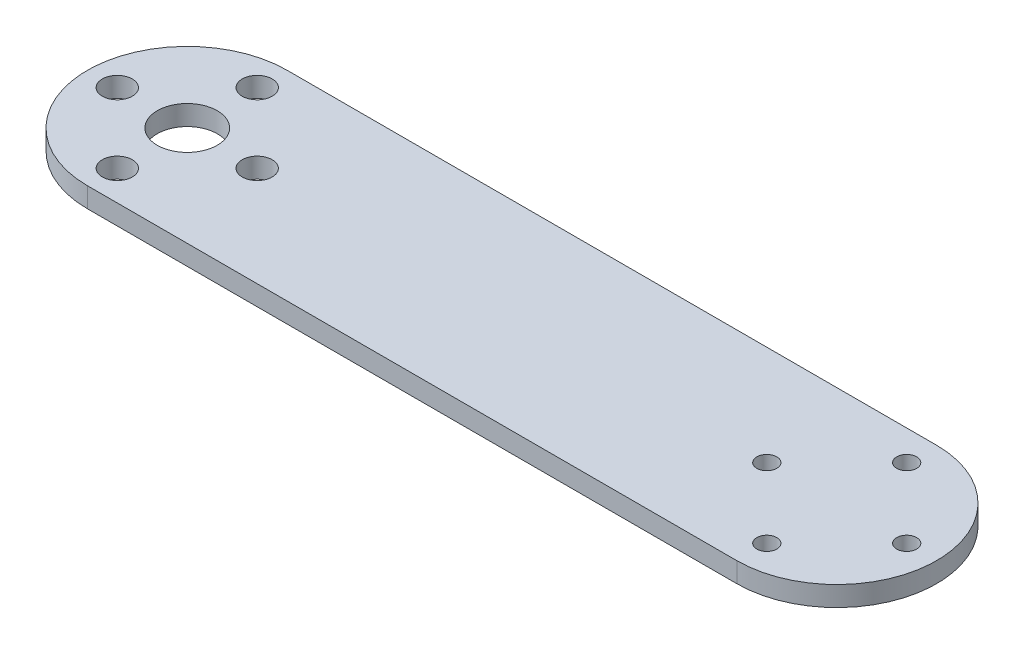
ISO-10303-21;
HEADER;
FILE_DESCRIPTION(('STEP AP214'),'2;1');
FILE_NAME('part.step','',(''),(''),'','','');
FILE_SCHEMA(('AUTOMOTIVE_DESIGN { 1 0 10303 214 1 1 1 1 }'));
ENDSEC;
DATA;
#1=APPLICATION_CONTEXT('core data for automotive mechanical design processes');
#2=APPLICATION_PROTOCOL_DEFINITION('international standard','automotive_design',2000,#1);
#3=PRODUCT_CONTEXT('',#1,'mechanical');
#4=PRODUCT('Part','Part','',(#3));
#5=PRODUCT_RELATED_PRODUCT_CATEGORY('part','',(#4));
#6=PRODUCT_DEFINITION_FORMATION('','',#4);
#7=PRODUCT_DEFINITION_CONTEXT('part definition',#1,'design');
#8=PRODUCT_DEFINITION('design','',#6,#7);
#9=PRODUCT_DEFINITION_SHAPE('','',#8);
#10=(LENGTH_UNIT() NAMED_UNIT(*) SI_UNIT(.MILLI.,.METRE.));
#11=(NAMED_UNIT(*) PLANE_ANGLE_UNIT() SI_UNIT($,.RADIAN.));
#12=(NAMED_UNIT(*) SI_UNIT($,.STERADIAN.) SOLID_ANGLE_UNIT());
#13=UNCERTAINTY_MEASURE_WITH_UNIT(LENGTH_MEASURE(1.E-05),#10,'distance_accuracy_value','');
#14=(GEOMETRIC_REPRESENTATION_CONTEXT(3) GLOBAL_UNCERTAINTY_ASSIGNED_CONTEXT((#13)) GLOBAL_UNIT_ASSIGNED_CONTEXT((#10,
#11,#12)) REPRESENTATION_CONTEXT('',''));
#15=CARTESIAN_POINT('',(0.,0.,0.));
#16=DIRECTION('',(0.,0.,1.));
#17=DIRECTION('',(1.,0.,0.));
#18=AXIS2_PLACEMENT_3D('',#15,#16,#17);
#19=CARTESIAN_POINT('',(0.,2.,0.));
#20=DIRECTION('',(0.,1.,0.));
#21=DIRECTION('',(0.,0.,1.));
#22=AXIS2_PLACEMENT_3D('',#19,#20,#21);
#23=PLANE('',#22);
#24=CARTESIAN_POINT('',(65.,2.,7.00000000000001));
#25=DIRECTION('',(0.,1.,0.));
#26=DIRECTION('',(0.,0.,1.));
#27=AXIS2_PLACEMENT_3D('',#24,#25,#26);
#28=CIRCLE('',#27,0.999999999999969);
#29=CARTESIAN_POINT('',(65.,2.,7.99999999999998));
#30=VERTEX_POINT('',#29);
#31=EDGE_CURVE('E153',#30,#30,#28,.T.);
#32=ORIENTED_EDGE('',*,*,#31,.F.);
#33=EDGE_LOOP('',(#32));
#34=FACE_BOUND('',#33,.T.);
#35=CARTESIAN_POINT('',(65.,2.,-7.00000000000001));
#36=DIRECTION('',(0.,1.,0.));
#37=DIRECTION('',(0.,0.,1.));
#38=AXIS2_PLACEMENT_3D('',#35,#36,#37);
#39=CIRCLE('',#38,0.999999999999969);
#40=CARTESIAN_POINT('',(65.,2.,-6.00000000000005));
#41=VERTEX_POINT('',#40);
#42=EDGE_CURVE('E141',#41,#41,#39,.T.);
#43=ORIENTED_EDGE('',*,*,#42,.F.);
#44=EDGE_LOOP('',(#43));
#45=FACE_BOUND('',#44,.T.);
#46=CARTESIAN_POINT('',(0.,2.,7.));
#47=DIRECTION('',(0.,1.,0.));
#48=DIRECTION('',(0.,0.,1.));
#49=AXIS2_PLACEMENT_3D('',#46,#47,#48);
#50=CIRCLE('',#49,1.5);
#51=CARTESIAN_POINT('',(0.,2.,8.5));
#52=VERTEX_POINT('',#51);
#53=EDGE_CURVE('E129',#52,#52,#50,.T.);
#54=ORIENTED_EDGE('',*,*,#53,.F.);
#55=EDGE_LOOP('',(#54));
#56=FACE_BOUND('',#55,.T.);
#57=CARTESIAN_POINT('',(0.,2.,-7.));
#58=DIRECTION('',(0.,1.,0.));
#59=DIRECTION('',(0.,0.,1.));
#60=AXIS2_PLACEMENT_3D('',#57,#58,#59);
#61=CIRCLE('',#60,1.5);
#62=CARTESIAN_POINT('',(0.,2.,-5.5));
#63=VERTEX_POINT('',#62);
#64=EDGE_CURVE('E117',#63,#63,#61,.T.);
#65=ORIENTED_EDGE('',*,*,#64,.F.);
#66=EDGE_LOOP('',(#65));
#67=FACE_BOUND('',#66,.T.);
#68=CARTESIAN_POINT('',(0.,2.,0.));
#69=DIRECTION('',(0.,1.,0.));
#70=DIRECTION('',(0.,0.,1.));
#71=AXIS2_PLACEMENT_3D('',#68,#69,#70);
#72=CIRCLE('',#71,10.);
#73=CARTESIAN_POINT('',(0.,2.,-10.));
#74=VERTEX_POINT('',#73);
#75=CARTESIAN_POINT('',(0.,2.,10.));
#76=VERTEX_POINT('',#75);
#77=EDGE_CURVE('E87',#74,#76,#72,.T.);
#78=ORIENTED_EDGE('',*,*,#77,.T.);
#79=DIRECTION('',(1.,0.,0.));
#80=VECTOR('',#79,1.);
#81=CARTESIAN_POINT('',(0.,2.,10.));
#82=LINE('',#81,#80);
#83=CARTESIAN_POINT('',(65.,2.,10.));
#84=VERTEX_POINT('',#83);
#85=EDGE_CURVE('E82',#76,#84,#82,.T.);
#86=ORIENTED_EDGE('',*,*,#85,.T.);
#87=CARTESIAN_POINT('',(65.,2.,0.));
#88=DIRECTION('',(0.,1.,0.));
#89=DIRECTION('',(0.,0.,1.));
#90=AXIS2_PLACEMENT_3D('',#87,#88,#89);
#91=CIRCLE('',#90,10.);
#92=CARTESIAN_POINT('',(65.,2.,-10.));
#93=VERTEX_POINT('',#92);
#94=EDGE_CURVE('E85',#84,#93,#91,.T.);
#95=ORIENTED_EDGE('',*,*,#94,.T.);
#96=DIRECTION('',(-1.,0.,0.));
#97=VECTOR('',#96,1.);
#98=CARTESIAN_POINT('',(0.,2.,-10.));
#99=LINE('',#98,#97);
#100=EDGE_CURVE('E52',#93,#74,#99,.T.);
#101=ORIENTED_EDGE('',*,*,#100,.T.);
#102=EDGE_LOOP('',(#78,#86,#95,#101));
#103=FACE_BOUND('',#102,.T.);
#104=CARTESIAN_POINT('',(0.,2.,0.));
#105=DIRECTION('',(0.,1.,0.));
#106=DIRECTION('',(0.,0.,1.));
#107=AXIS2_PLACEMENT_3D('',#104,#105,#106);
#108=CIRCLE('',#107,3.);
#109=CARTESIAN_POINT('',(0.,2.,3.));
#110=VERTEX_POINT('',#109);
#111=EDGE_CURVE('E102',#110,#110,#108,.T.);
#112=ORIENTED_EDGE('',*,*,#111,.F.);
#113=EDGE_LOOP('',(#112));
#114=FACE_BOUND('',#113,.T.);
#115=CARTESIAN_POINT('',(7.,2.,0.));
#116=DIRECTION('',(0.,1.,0.));
#117=DIRECTION('',(0.,0.,1.));
#118=AXIS2_PLACEMENT_3D('',#115,#116,#117);
#119=CIRCLE('',#118,1.5);
#120=CARTESIAN_POINT('',(7.,2.,1.5));
#121=VERTEX_POINT('',#120);
#122=EDGE_CURVE('E123',#121,#121,#119,.T.);
#123=ORIENTED_EDGE('',*,*,#122,.F.);
#124=EDGE_LOOP('',(#123));
#125=FACE_BOUND('',#124,.T.);
#126=CARTESIAN_POINT('',(-7.,2.,0.));
#127=DIRECTION('',(0.,1.,0.));
#128=DIRECTION('',(0.,0.,1.));
#129=AXIS2_PLACEMENT_3D('',#126,#127,#128);
#130=CIRCLE('',#129,1.5);
#131=CARTESIAN_POINT('',(-7.,2.,1.5));
#132=VERTEX_POINT('',#131);
#133=EDGE_CURVE('E135',#132,#132,#130,.T.);
#134=ORIENTED_EDGE('',*,*,#133,.F.);
#135=EDGE_LOOP('',(#134));
#136=FACE_BOUND('',#135,.T.);
#137=CARTESIAN_POINT('',(72.,2.,0.));
#138=DIRECTION('',(0.,1.,0.));
#139=DIRECTION('',(0.,0.,1.));
#140=AXIS2_PLACEMENT_3D('',#137,#138,#139);
#141=CIRCLE('',#140,0.999999999999998);
#142=CARTESIAN_POINT('',(72.,2.,0.999999999999998));
#143=VERTEX_POINT('',#142);
#144=EDGE_CURVE('E147',#143,#143,#141,.T.);
#145=ORIENTED_EDGE('',*,*,#144,.F.);
#146=EDGE_LOOP('',(#145));
#147=FACE_BOUND('',#146,.T.);
#148=CARTESIAN_POINT('',(58.,2.,0.));
#149=DIRECTION('',(0.,1.,0.));
#150=DIRECTION('',(0.,0.,1.));
#151=AXIS2_PLACEMENT_3D('',#148,#149,#150);
#152=CIRCLE('',#151,0.999999999999984);
#153=CARTESIAN_POINT('',(58.,2.,0.999999999999984));
#154=VERTEX_POINT('',#153);
#155=EDGE_CURVE('E159',#154,#154,#152,.T.);
#156=ORIENTED_EDGE('',*,*,#155,.F.);
#157=EDGE_LOOP('',(#156));
#158=FACE_BOUND('',#157,.T.);
#159=ADVANCED_FACE('F35',(#34,#45,#56,#67,#103,#114,#125,#136,#147,#158),#23,.T.);
#160=CARTESIAN_POINT('',(0.,0.,0.));
#161=DIRECTION('',(0.,1.,0.));
#162=DIRECTION('',(0.,0.,1.));
#163=AXIS2_PLACEMENT_3D('',#160,#161,#162);
#164=PLANE('',#163);
#165=CARTESIAN_POINT('',(0.,0.,0.));
#166=DIRECTION('',(0.,1.,0.));
#167=DIRECTION('',(0.,0.,1.));
#168=AXIS2_PLACEMENT_3D('',#165,#166,#167);
#169=CIRCLE('',#168,10.);
#170=CARTESIAN_POINT('',(0.,0.,-10.));
#171=VERTEX_POINT('',#170);
#172=CARTESIAN_POINT('',(0.,0.,10.));
#173=VERTEX_POINT('',#172);
#174=EDGE_CURVE('E99',#171,#173,#169,.T.);
#175=ORIENTED_EDGE('',*,*,#174,.F.);
#176=DIRECTION('',(-1.,0.,0.));
#177=VECTOR('',#176,1.);
#178=CARTESIAN_POINT('',(0.,0.,-10.));
#179=LINE('',#178,#177);
#180=CARTESIAN_POINT('',(65.,0.,-10.));
#181=VERTEX_POINT('',#180);
#182=EDGE_CURVE('E75',#181,#171,#179,.T.);
#183=ORIENTED_EDGE('',*,*,#182,.F.);
#184=CARTESIAN_POINT('',(65.,0.,0.));
#185=DIRECTION('',(0.,1.,0.));
#186=DIRECTION('',(0.,0.,1.));
#187=AXIS2_PLACEMENT_3D('',#184,#185,#186);
#188=CIRCLE('',#187,10.);
#189=CARTESIAN_POINT('',(65.,0.,10.));
#190=VERTEX_POINT('',#189);
#191=EDGE_CURVE('E69',#190,#181,#188,.T.);
#192=ORIENTED_EDGE('',*,*,#191,.F.);
#193=DIRECTION('',(1.,0.,0.));
#194=VECTOR('',#193,1.);
#195=CARTESIAN_POINT('',(0.,0.,10.));
#196=LINE('',#195,#194);
#197=EDGE_CURVE('E91',#173,#190,#196,.T.);
#198=ORIENTED_EDGE('',*,*,#197,.F.);
#199=EDGE_LOOP('',(#175,#183,#192,#198));
#200=FACE_BOUND('',#199,.T.);
#201=CARTESIAN_POINT('',(0.,0.,0.));
#202=DIRECTION('',(0.,1.,0.));
#203=DIRECTION('',(0.,0.,1.));
#204=AXIS2_PLACEMENT_3D('',#201,#202,#203);
#205=CIRCLE('',#204,3.);
#206=CARTESIAN_POINT('',(0.,0.,3.));
#207=VERTEX_POINT('',#206);
#208=EDGE_CURVE('E114',#207,#207,#205,.T.);
#209=ORIENTED_EDGE('',*,*,#208,.T.);
#210=EDGE_LOOP('',(#209));
#211=FACE_BOUND('',#210,.T.);
#212=CARTESIAN_POINT('',(0.,0.,-7.));
#213=DIRECTION('',(0.,1.,0.));
#214=DIRECTION('',(0.,0.,1.));
#215=AXIS2_PLACEMENT_3D('',#212,#213,#214);
#216=CIRCLE('',#215,1.5);
#217=CARTESIAN_POINT('',(0.,0.,-5.5));
#218=VERTEX_POINT('',#217);
#219=EDGE_CURVE('E120',#218,#218,#216,.T.);
#220=ORIENTED_EDGE('',*,*,#219,.T.);
#221=EDGE_LOOP('',(#220));
#222=FACE_BOUND('',#221,.T.);
#223=CARTESIAN_POINT('',(7.,0.,0.));
#224=DIRECTION('',(0.,1.,0.));
#225=DIRECTION('',(0.,0.,1.));
#226=AXIS2_PLACEMENT_3D('',#223,#224,#225);
#227=CIRCLE('',#226,1.5);
#228=CARTESIAN_POINT('',(7.,0.,1.5));
#229=VERTEX_POINT('',#228);
#230=EDGE_CURVE('E126',#229,#229,#227,.T.);
#231=ORIENTED_EDGE('',*,*,#230,.T.);
#232=EDGE_LOOP('',(#231));
#233=FACE_BOUND('',#232,.T.);
#234=CARTESIAN_POINT('',(0.,0.,7.));
#235=DIRECTION('',(0.,1.,0.));
#236=DIRECTION('',(0.,0.,1.));
#237=AXIS2_PLACEMENT_3D('',#234,#235,#236);
#238=CIRCLE('',#237,1.5);
#239=CARTESIAN_POINT('',(0.,0.,8.5));
#240=VERTEX_POINT('',#239);
#241=EDGE_CURVE('E132',#240,#240,#238,.T.);
#242=ORIENTED_EDGE('',*,*,#241,.T.);
#243=EDGE_LOOP('',(#242));
#244=FACE_BOUND('',#243,.T.);
#245=CARTESIAN_POINT('',(-7.,0.,0.));
#246=DIRECTION('',(0.,1.,0.));
#247=DIRECTION('',(0.,0.,1.));
#248=AXIS2_PLACEMENT_3D('',#245,#246,#247);
#249=CIRCLE('',#248,1.5);
#250=CARTESIAN_POINT('',(-7.,0.,1.5));
#251=VERTEX_POINT('',#250);
#252=EDGE_CURVE('E138',#251,#251,#249,.T.);
#253=ORIENTED_EDGE('',*,*,#252,.T.);
#254=EDGE_LOOP('',(#253));
#255=FACE_BOUND('',#254,.T.);
#256=CARTESIAN_POINT('',(65.,0.,-7.00000000000001));
#257=DIRECTION('',(0.,1.,0.));
#258=DIRECTION('',(0.,0.,1.));
#259=AXIS2_PLACEMENT_3D('',#256,#257,#258);
#260=CIRCLE('',#259,0.999999999999969);
#261=CARTESIAN_POINT('',(65.,0.,-6.00000000000005));
#262=VERTEX_POINT('',#261);
#263=EDGE_CURVE('E144',#262,#262,#260,.T.);
#264=ORIENTED_EDGE('',*,*,#263,.T.);
#265=EDGE_LOOP('',(#264));
#266=FACE_BOUND('',#265,.T.);
#267=CARTESIAN_POINT('',(72.,0.,0.));
#268=DIRECTION('',(0.,1.,0.));
#269=DIRECTION('',(0.,0.,1.));
#270=AXIS2_PLACEMENT_3D('',#267,#268,#269);
#271=CIRCLE('',#270,0.999999999999998);
#272=CARTESIAN_POINT('',(72.,0.,0.999999999999998));
#273=VERTEX_POINT('',#272);
#274=EDGE_CURVE('E150',#273,#273,#271,.T.);
#275=ORIENTED_EDGE('',*,*,#274,.T.);
#276=EDGE_LOOP('',(#275));
#277=FACE_BOUND('',#276,.T.);
#278=CARTESIAN_POINT('',(65.,0.,7.00000000000001));
#279=DIRECTION('',(0.,1.,0.));
#280=DIRECTION('',(0.,0.,1.));
#281=AXIS2_PLACEMENT_3D('',#278,#279,#280);
#282=CIRCLE('',#281,0.999999999999969);
#283=CARTESIAN_POINT('',(65.,0.,7.99999999999998));
#284=VERTEX_POINT('',#283);
#285=EDGE_CURVE('E156',#284,#284,#282,.T.);
#286=ORIENTED_EDGE('',*,*,#285,.T.);
#287=EDGE_LOOP('',(#286));
#288=FACE_BOUND('',#287,.T.);
#289=CARTESIAN_POINT('',(58.,0.,0.));
#290=DIRECTION('',(0.,1.,0.));
#291=DIRECTION('',(0.,0.,1.));
#292=AXIS2_PLACEMENT_3D('',#289,#290,#291);
#293=CIRCLE('',#292,0.999999999999984);
#294=CARTESIAN_POINT('',(58.,0.,0.999999999999984));
#295=VERTEX_POINT('',#294);
#296=EDGE_CURVE('E162',#295,#295,#293,.T.);
#297=ORIENTED_EDGE('',*,*,#296,.T.);
#298=EDGE_LOOP('',(#297));
#299=FACE_BOUND('',#298,.T.);
#300=ADVANCED_FACE('F110',(#200,#211,#222,#233,#244,#255,#266,#277,#288,#299),#164,.F.);
#301=CARTESIAN_POINT('',(0.,2.,0.));
#302=DIRECTION('',(0.,-1.,0.));
#303=DIRECTION('',(0.,0.,-1.));
#304=AXIS2_PLACEMENT_3D('',#301,#302,#303);
#305=CYLINDRICAL_SURFACE('',#304,10.);
#306=ORIENTED_EDGE('',*,*,#174,.T.);
#307=DIRECTION('',(0.,-1.,0.));
#308=VECTOR('',#307,1.);
#309=CARTESIAN_POINT('',(0.,2.,10.));
#310=LINE('',#309,#308);
#311=EDGE_CURVE('E11',#76,#173,#310,.T.);
#312=ORIENTED_EDGE('',*,*,#311,.F.);
#313=ORIENTED_EDGE('',*,*,#77,.F.);
#314=DIRECTION('',(0.,-1.,0.));
#315=VECTOR('',#314,1.);
#316=CARTESIAN_POINT('',(0.,2.,-10.));
#317=LINE('',#316,#315);
#318=EDGE_CURVE('E95',#74,#171,#317,.T.);
#319=ORIENTED_EDGE('',*,*,#318,.T.);
#320=EDGE_LOOP('',(#306,#312,#313,#319));
#321=FACE_BOUND('',#320,.T.);
#322=ADVANCED_FACE('F37',(#321),#305,.T.);
#323=CARTESIAN_POINT('',(0.,2.,10.));
#324=DIRECTION('',(0.,0.,-1.));
#325=DIRECTION('',(-1.,0.,0.));
#326=AXIS2_PLACEMENT_3D('',#323,#324,#325);
#327=PLANE('',#326);
#328=ORIENTED_EDGE('',*,*,#197,.T.);
#329=DIRECTION('',(0.,-1.,0.));
#330=VECTOR('',#329,1.);
#331=CARTESIAN_POINT('',(65.,2.,10.));
#332=LINE('',#331,#330);
#333=EDGE_CURVE('E44',#84,#190,#332,.T.);
#334=ORIENTED_EDGE('',*,*,#333,.F.);
#335=ORIENTED_EDGE('',*,*,#85,.F.);
#336=ORIENTED_EDGE('',*,*,#311,.T.);
#337=EDGE_LOOP('',(#328,#334,#335,#336));
#338=FACE_BOUND('',#337,.T.);
#339=ADVANCED_FACE('F90',(#338),#327,.F.);
#340=CARTESIAN_POINT('',(65.,2.,0.));
#341=DIRECTION('',(0.,-1.,0.));
#342=DIRECTION('',(0.,0.,-1.));
#343=AXIS2_PLACEMENT_3D('',#340,#341,#342);
#344=CYLINDRICAL_SURFACE('',#343,10.);
#345=ORIENTED_EDGE('',*,*,#191,.T.);
#346=DIRECTION('',(0.,-1.,0.));
#347=VECTOR('',#346,1.);
#348=CARTESIAN_POINT('',(65.,2.,-10.));
#349=LINE('',#348,#347);
#350=EDGE_CURVE('E92',#93,#181,#349,.T.);
#351=ORIENTED_EDGE('',*,*,#350,.F.);
#352=ORIENTED_EDGE('',*,*,#94,.F.);
#353=ORIENTED_EDGE('',*,*,#333,.T.);
#354=EDGE_LOOP('',(#345,#351,#352,#353));
#355=FACE_BOUND('',#354,.T.);
#356=ADVANCED_FACE('F93',(#355),#344,.T.);
#357=CARTESIAN_POINT('',(0.,2.,-10.));
#358=DIRECTION('',(0.,0.,1.));
#359=DIRECTION('',(1.,0.,0.));
#360=AXIS2_PLACEMENT_3D('',#357,#358,#359);
#361=PLANE('',#360);
#362=ORIENTED_EDGE('',*,*,#182,.T.);
#363=ORIENTED_EDGE('',*,*,#318,.F.);
#364=ORIENTED_EDGE('',*,*,#100,.F.);
#365=ORIENTED_EDGE('',*,*,#350,.T.);
#366=EDGE_LOOP('',(#362,#363,#364,#365));
#367=FACE_BOUND('',#366,.T.);
#368=ADVANCED_FACE('F107',(#367),#361,.F.);
#369=CARTESIAN_POINT('',(0.,2.,0.));
#370=DIRECTION('',(0.,-1.,0.));
#371=DIRECTION('',(0.,0.,-1.));
#372=AXIS2_PLACEMENT_3D('',#369,#370,#371);
#373=CYLINDRICAL_SURFACE('',#372,3.);
#374=ORIENTED_EDGE('',*,*,#111,.T.);
#375=EDGE_LOOP('',(#374));
#376=FACE_BOUND('',#375,.T.);
#377=ORIENTED_EDGE('',*,*,#208,.F.);
#378=EDGE_LOOP('',(#377));
#379=FACE_BOUND('',#378,.T.);
#380=ADVANCED_FACE('F181',(#376,#379),#373,.F.);
#381=CARTESIAN_POINT('',(0.,2.,-7.));
#382=DIRECTION('',(0.,-1.,0.));
#383=DIRECTION('',(0.,0.,-1.));
#384=AXIS2_PLACEMENT_3D('',#381,#382,#383);
#385=CYLINDRICAL_SURFACE('',#384,1.5);
#386=ORIENTED_EDGE('',*,*,#64,.T.);
#387=EDGE_LOOP('',(#386));
#388=FACE_BOUND('',#387,.T.);
#389=ORIENTED_EDGE('',*,*,#219,.F.);
#390=EDGE_LOOP('',(#389));
#391=FACE_BOUND('',#390,.T.);
#392=ADVANCED_FACE('F227',(#388,#391),#385,.F.);
#393=CARTESIAN_POINT('',(7.,2.,0.));
#394=DIRECTION('',(0.,-1.,0.));
#395=DIRECTION('',(0.,0.,-1.));
#396=AXIS2_PLACEMENT_3D('',#393,#394,#395);
#397=CYLINDRICAL_SURFACE('',#396,1.5);
#398=ORIENTED_EDGE('',*,*,#122,.T.);
#399=EDGE_LOOP('',(#398));
#400=FACE_BOUND('',#399,.T.);
#401=ORIENTED_EDGE('',*,*,#230,.F.);
#402=EDGE_LOOP('',(#401));
#403=FACE_BOUND('',#402,.T.);
#404=ADVANCED_FACE('F235',(#400,#403),#397,.F.);
#405=CARTESIAN_POINT('',(0.,2.,7.));
#406=DIRECTION('',(0.,-1.,0.));
#407=DIRECTION('',(0.,0.,-1.));
#408=AXIS2_PLACEMENT_3D('',#405,#406,#407);
#409=CYLINDRICAL_SURFACE('',#408,1.5);
#410=ORIENTED_EDGE('',*,*,#53,.T.);
#411=EDGE_LOOP('',(#410));
#412=FACE_BOUND('',#411,.T.);
#413=ORIENTED_EDGE('',*,*,#241,.F.);
#414=EDGE_LOOP('',(#413));
#415=FACE_BOUND('',#414,.T.);
#416=ADVANCED_FACE('F243',(#412,#415),#409,.F.);
#417=CARTESIAN_POINT('',(-7.,2.,0.));
#418=DIRECTION('',(0.,-1.,0.));
#419=DIRECTION('',(0.,0.,-1.));
#420=AXIS2_PLACEMENT_3D('',#417,#418,#419);
#421=CYLINDRICAL_SURFACE('',#420,1.5);
#422=ORIENTED_EDGE('',*,*,#133,.T.);
#423=EDGE_LOOP('',(#422));
#424=FACE_BOUND('',#423,.T.);
#425=ORIENTED_EDGE('',*,*,#252,.F.);
#426=EDGE_LOOP('',(#425));
#427=FACE_BOUND('',#426,.T.);
#428=ADVANCED_FACE('F252',(#424,#427),#421,.F.);
#429=CARTESIAN_POINT('',(65.,2.,-7.00000000000001));
#430=DIRECTION('',(0.,-1.,0.));
#431=DIRECTION('',(0.,0.,-1.));
#432=AXIS2_PLACEMENT_3D('',#429,#430,#431);
#433=CYLINDRICAL_SURFACE('',#432,0.999999999999969);
#434=ORIENTED_EDGE('',*,*,#42,.T.);
#435=EDGE_LOOP('',(#434));
#436=FACE_BOUND('',#435,.T.);
#437=ORIENTED_EDGE('',*,*,#263,.F.);
#438=EDGE_LOOP('',(#437));
#439=FACE_BOUND('',#438,.T.);
#440=ADVANCED_FACE('F261',(#436,#439),#433,.F.);
#441=CARTESIAN_POINT('',(72.,2.,0.));
#442=DIRECTION('',(0.,-1.,0.));
#443=DIRECTION('',(0.,0.,-1.));
#444=AXIS2_PLACEMENT_3D('',#441,#442,#443);
#445=CYLINDRICAL_SURFACE('',#444,0.999999999999998);
#446=ORIENTED_EDGE('',*,*,#144,.T.);
#447=EDGE_LOOP('',(#446));
#448=FACE_BOUND('',#447,.T.);
#449=ORIENTED_EDGE('',*,*,#274,.F.);
#450=EDGE_LOOP('',(#449));
#451=FACE_BOUND('',#450,.T.);
#452=ADVANCED_FACE('F270',(#448,#451),#445,.F.);
#453=CARTESIAN_POINT('',(65.,2.,7.00000000000001));
#454=DIRECTION('',(0.,-1.,0.));
#455=DIRECTION('',(0.,0.,-1.));
#456=AXIS2_PLACEMENT_3D('',#453,#454,#455);
#457=CYLINDRICAL_SURFACE('',#456,0.999999999999969);
#458=ORIENTED_EDGE('',*,*,#31,.T.);
#459=EDGE_LOOP('',(#458));
#460=FACE_BOUND('',#459,.T.);
#461=ORIENTED_EDGE('',*,*,#285,.F.);
#462=EDGE_LOOP('',(#461));
#463=FACE_BOUND('',#462,.T.);
#464=ADVANCED_FACE('F279',(#460,#463),#457,.F.);
#465=CARTESIAN_POINT('',(58.,2.,0.));
#466=DIRECTION('',(0.,-1.,0.));
#467=DIRECTION('',(0.,0.,-1.));
#468=AXIS2_PLACEMENT_3D('',#465,#466,#467);
#469=CYLINDRICAL_SURFACE('',#468,0.999999999999984);
#470=ORIENTED_EDGE('',*,*,#155,.T.);
#471=EDGE_LOOP('',(#470));
#472=FACE_BOUND('',#471,.T.);
#473=ORIENTED_EDGE('',*,*,#296,.F.);
#474=EDGE_LOOP('',(#473));
#475=FACE_BOUND('',#474,.T.);
#476=ADVANCED_FACE('F168',(#472,#475),#469,.F.);
#477=CLOSED_SHELL('',(#159,#300,#322,#339,#356,#368,#380,#392,#404,#416,#428,#440,#452,#464,#476));
#478=MANIFOLD_SOLID_BREP('B2',#477);
#479=ADVANCED_BREP_SHAPE_REPRESENTATION('',(#18,#478),#14);
#480=SHAPE_DEFINITION_REPRESENTATION(#9,#479);
ENDSEC;
END-ISO-10303-21;
